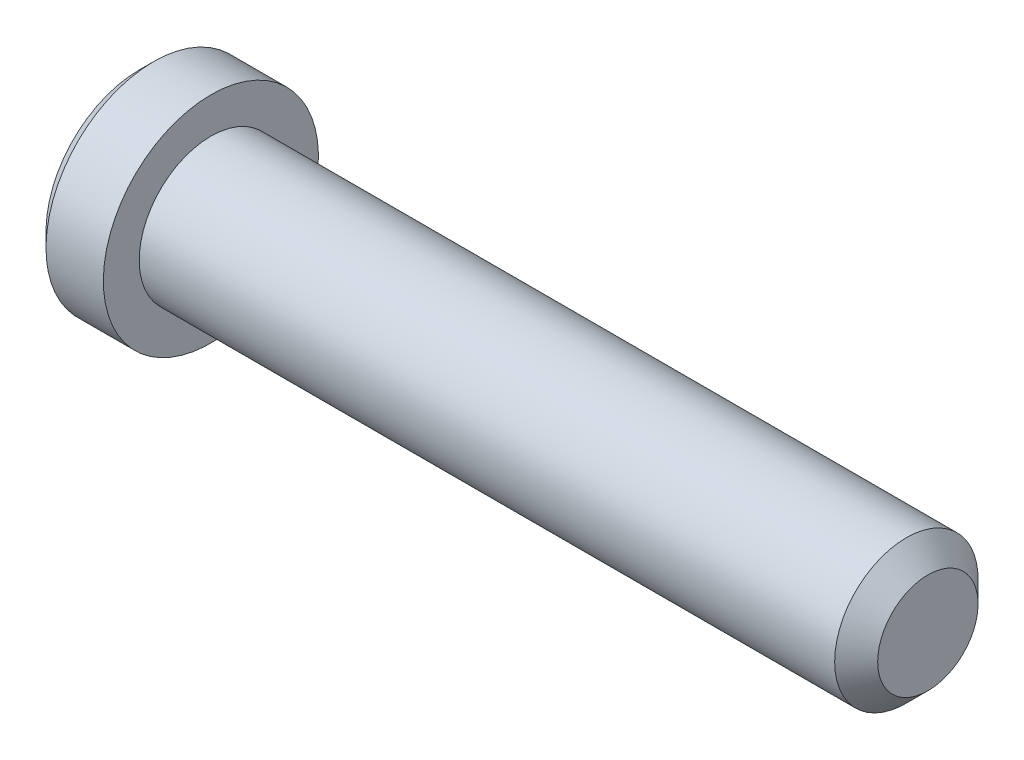
ISO-10303-21;
HEADER;
FILE_DESCRIPTION(('STEP AP214'),'2;1');
FILE_NAME('part.step','',(''),(''),'','','');
FILE_SCHEMA(('AUTOMOTIVE_DESIGN { 1 0 10303 214 1 1 1 1 }'));
ENDSEC;
DATA;
#1=APPLICATION_CONTEXT('core data for automotive mechanical design processes');
#2=APPLICATION_PROTOCOL_DEFINITION('international standard','automotive_design',2000,#1);
#3=PRODUCT_CONTEXT('',#1,'mechanical');
#4=PRODUCT('Part','Part','',(#3));
#5=PRODUCT_RELATED_PRODUCT_CATEGORY('part','',(#4));
#6=PRODUCT_DEFINITION_FORMATION('','',#4);
#7=PRODUCT_DEFINITION_CONTEXT('part definition',#1,'design');
#8=PRODUCT_DEFINITION('design','',#6,#7);
#9=PRODUCT_DEFINITION_SHAPE('','',#8);
#10=(LENGTH_UNIT() NAMED_UNIT(*) SI_UNIT(.MILLI.,.METRE.));
#11=(NAMED_UNIT(*) PLANE_ANGLE_UNIT() SI_UNIT($,.RADIAN.));
#12=(NAMED_UNIT(*) SI_UNIT($,.STERADIAN.) SOLID_ANGLE_UNIT());
#13=UNCERTAINTY_MEASURE_WITH_UNIT(LENGTH_MEASURE(1.E-05),#10,'distance_accuracy_value','');
#14=(GEOMETRIC_REPRESENTATION_CONTEXT(3) GLOBAL_UNCERTAINTY_ASSIGNED_CONTEXT((#13)) GLOBAL_UNIT_ASSIGNED_CONTEXT((#10,
#11,#12)) REPRESENTATION_CONTEXT('',''));
#15=CARTESIAN_POINT('',(0.,0.,0.));
#16=DIRECTION('',(0.,0.,1.));
#17=DIRECTION('',(1.,0.,0.));
#18=AXIS2_PLACEMENT_3D('',#15,#16,#17);
#19=CARTESIAN_POINT('',(-19.05,4.12749999999999,0.));
#20=DIRECTION('',(-1.,0.,0.));
#21=DIRECTION('',(0.,-1.,0.));
#22=AXIS2_PLACEMENT_3D('',#19,#20,#21);
#23=PLANE('',#22);
#24=CARTESIAN_POINT('',(-19.05,0.,0.));
#25=DIRECTION('',(-1.,0.,0.));
#26=DIRECTION('',(0.,-1.,0.));
#27=AXIS2_PLACEMENT_3D('',#24,#25,#26);
#28=CIRCLE('',#27,1.83308710467702);
#29=CARTESIAN_POINT('',(-19.05,-1.83308710467697,-1.64690310000548E-13));
#30=VERTEX_POINT('',#29);
#31=CARTESIAN_POINT('',(-19.05,-0.916543552338599,1.58749999999988));
#32=VERTEX_POINT('',#31);
#33=EDGE_CURVE('E142',#30,#32,#28,.T.);
#34=ORIENTED_EDGE('',*,*,#33,.F.);
#35=CARTESIAN_POINT('',(-19.05,-0.916543552338531,-1.5875));
#36=VERTEX_POINT('',#35);
#37=EDGE_CURVE('E139',#36,#30,#28,.T.);
#38=ORIENTED_EDGE('',*,*,#37,.F.);
#39=CARTESIAN_POINT('',(-19.05,0.916543552338507,-1.5875));
#40=VERTEX_POINT('',#39);
#41=EDGE_CURVE('E107',#40,#36,#28,.T.);
#42=ORIENTED_EDGE('',*,*,#41,.F.);
#43=CARTESIAN_POINT('',(-19.05,1.83308710467708,0.));
#44=VERTEX_POINT('',#43);
#45=EDGE_CURVE('E99',#44,#40,#28,.T.);
#46=ORIENTED_EDGE('',*,*,#45,.F.);
#47=CARTESIAN_POINT('',(-19.05,0.916543552338506,1.5875));
#48=VERTEX_POINT('',#47);
#49=EDGE_CURVE('E60',#48,#44,#28,.T.);
#50=ORIENTED_EDGE('',*,*,#49,.F.);
#51=EDGE_CURVE('E67',#32,#48,#28,.T.);
#52=ORIENTED_EDGE('',*,*,#51,.F.);
#53=EDGE_LOOP('',(#34,#38,#42,#46,#50,#52));
#54=FACE_BOUND('',#53,.T.);
#55=CARTESIAN_POINT('',(-19.05,0.,0.));
#56=DIRECTION('',(1.,0.,0.));
#57=DIRECTION('',(0.,1.,0.));
#58=AXIS2_PLACEMENT_3D('',#55,#56,#57);
#59=CIRCLE('',#58,4.12749999999999);
#60=CARTESIAN_POINT('',(-19.05,4.12749999999999,0.));
#61=VERTEX_POINT('',#60);
#62=EDGE_CURVE('E237',#61,#61,#59,.T.);
#63=ORIENTED_EDGE('',*,*,#62,.F.);
#64=EDGE_LOOP('',(#63));
#65=FACE_BOUND('',#64,.T.);
#66=ADVANCED_FACE('F39',(#54,#65),#23,.T.);
#67=CARTESIAN_POINT('',(-15.875,0.,0.));
#68=DIRECTION('',(1.,0.,0.));
#69=DIRECTION('',(0.,0.,-1.));
#70=AXIS2_PLACEMENT_3D('',#67,#68,#69);
#71=CYLINDRICAL_SURFACE('',#70,3.175);
#72=CARTESIAN_POINT('',(14.9225,0.,0.));
#73=DIRECTION('',(1.,0.,0.));
#74=DIRECTION('',(0.,0.,-1.));
#75=AXIS2_PLACEMENT_3D('',#72,#73,#74);
#76=CIRCLE('',#75,3.175);
#77=CARTESIAN_POINT('',(14.9225,0.,3.175));
#78=VERTEX_POINT('',#77);
#79=EDGE_CURVE('E54',#78,#78,#76,.F.);
#80=ORIENTED_EDGE('',*,*,#79,.T.);
#81=EDGE_LOOP('',(#80));
#82=FACE_BOUND('',#81,.T.);
#83=CARTESIAN_POINT('',(-15.875,0.,0.));
#84=DIRECTION('',(1.,0.,0.));
#85=DIRECTION('',(0.,1.,0.));
#86=AXIS2_PLACEMENT_3D('',#83,#84,#85);
#87=CIRCLE('',#86,3.175);
#88=CARTESIAN_POINT('',(-15.875,3.17499999999999,0.));
#89=VERTEX_POINT('',#88);
#90=EDGE_CURVE('E227',#89,#89,#87,.F.);
#91=ORIENTED_EDGE('',*,*,#90,.F.);
#92=EDGE_LOOP('',(#91));
#93=FACE_BOUND('',#92,.T.);
#94=ADVANCED_FACE('F207',(#82,#93),#71,.T.);
#95=CARTESIAN_POINT('',(15.875,0.,0.));
#96=DIRECTION('',(1.,0.,0.));
#97=DIRECTION('',(0.,0.,-1.));
#98=AXIS2_PLACEMENT_3D('',#95,#96,#97);
#99=PLANE('',#98);
#100=CARTESIAN_POINT('',(15.875,0.,0.));
#101=DIRECTION('',(1.,0.,0.));
#102=DIRECTION('',(0.,0.,-1.));
#103=AXIS2_PLACEMENT_3D('',#100,#101,#102);
#104=CIRCLE('',#103,2.2225);
#105=CARTESIAN_POINT('',(15.875,0.,2.2225));
#106=VERTEX_POINT('',#105);
#107=EDGE_CURVE('E229',#106,#106,#104,.T.);
#108=ORIENTED_EDGE('',*,*,#107,.T.);
#109=EDGE_LOOP('',(#108));
#110=FACE_BOUND('',#109,.T.);
#111=ADVANCED_FACE('F215',(#110),#99,.T.);
#112=CARTESIAN_POINT('',(15.875,0.,0.));
#113=DIRECTION('',(-1.,0.,0.));
#114=DIRECTION('',(0.,0.,1.));
#115=AXIS2_PLACEMENT_3D('',#112,#113,#114);
#116=CONICAL_SURFACE('',#115,2.2225,0.785398163397445);
#117=CARTESIAN_POINT('',(14.9225,0.,3.175));
#118=CARTESIAN_POINT('',(14.932421875,0.,3.165078125));
#119=CARTESIAN_POINT('',(14.94234375,0.,3.15515625));
#120=CARTESIAN_POINT('',(14.9621875,0.,3.1353125));
#121=CARTESIAN_POINT('',(14.972109375,0.,3.125390625));
#122=CARTESIAN_POINT('',(14.991953125,0.,3.105546875));
#123=CARTESIAN_POINT('',(15.001875,0.,3.095625));
#124=CARTESIAN_POINT('',(15.02171875,0.,3.07578125));
#125=CARTESIAN_POINT('',(15.031640625,0.,3.065859375));
#126=CARTESIAN_POINT('',(15.051484375,0.,3.046015625));
#127=CARTESIAN_POINT('',(15.06140625,0.,3.03609375));
#128=CARTESIAN_POINT('',(15.08125,0.,3.01625));
#129=CARTESIAN_POINT('',(15.091171875,0.,3.006328125));
#130=CARTESIAN_POINT('',(15.111015625,0.,2.986484375));
#131=CARTESIAN_POINT('',(15.1209375,0.,2.9765625));
#132=CARTESIAN_POINT('',(15.14078125,0.,2.95671875));
#133=CARTESIAN_POINT('',(15.150703125,0.,2.946796875));
#134=CARTESIAN_POINT('',(15.170546875,0.,2.926953125));
#135=CARTESIAN_POINT('',(15.18046875,0.,2.91703125));
#136=CARTESIAN_POINT('',(15.2003125,0.,2.8971875));
#137=CARTESIAN_POINT('',(15.210234375,0.,2.887265625));
#138=CARTESIAN_POINT('',(15.230078125,0.,2.867421875));
#139=CARTESIAN_POINT('',(15.24,0.,2.8575));
#140=CARTESIAN_POINT('',(15.25984375,0.,2.83765625));
#141=CARTESIAN_POINT('',(15.269765625,0.,2.827734375));
#142=CARTESIAN_POINT('',(15.289609375,0.,2.807890625));
#143=CARTESIAN_POINT('',(15.29953125,0.,2.79796875));
#144=CARTESIAN_POINT('',(15.319375,0.,2.778125));
#145=CARTESIAN_POINT('',(15.329296875,0.,2.768203125));
#146=CARTESIAN_POINT('',(15.349140625,0.,2.748359375));
#147=CARTESIAN_POINT('',(15.3590625,0.,2.7384375));
#148=CARTESIAN_POINT('',(15.37890625,0.,2.71859375));
#149=CARTESIAN_POINT('',(15.388828125,0.,2.708671875));
#150=CARTESIAN_POINT('',(15.408671875,0.,2.688828125));
#151=CARTESIAN_POINT('',(15.41859375,0.,2.67890625));
#152=CARTESIAN_POINT('',(15.4384375,0.,2.6590625));
#153=CARTESIAN_POINT('',(15.448359375,0.,2.649140625));
#154=CARTESIAN_POINT('',(15.468203125,0.,2.629296875));
#155=CARTESIAN_POINT('',(15.478125,0.,2.619375));
#156=CARTESIAN_POINT('',(15.49796875,0.,2.59953125));
#157=CARTESIAN_POINT('',(15.507890625,0.,2.589609375));
#158=CARTESIAN_POINT('',(15.527734375,0.,2.569765625));
#159=CARTESIAN_POINT('',(15.53765625,0.,2.55984375));
#160=CARTESIAN_POINT('',(15.5575,0.,2.54));
#161=CARTESIAN_POINT('',(15.567421875,0.,2.530078125));
#162=CARTESIAN_POINT('',(15.587265625,0.,2.510234375));
#163=CARTESIAN_POINT('',(15.5971875,0.,2.5003125));
#164=CARTESIAN_POINT('',(15.61703125,0.,2.48046875));
#165=CARTESIAN_POINT('',(15.626953125,0.,2.470546875));
#166=CARTESIAN_POINT('',(15.646796875,0.,2.450703125));
#167=CARTESIAN_POINT('',(15.65671875,0.,2.44078125));
#168=CARTESIAN_POINT('',(15.6765625,0.,2.4209375));
#169=CARTESIAN_POINT('',(15.686484375,0.,2.411015625));
#170=CARTESIAN_POINT('',(15.706328125,0.,2.391171875));
#171=CARTESIAN_POINT('',(15.71625,0.,2.38125));
#172=CARTESIAN_POINT('',(15.73609375,0.,2.36140625));
#173=CARTESIAN_POINT('',(15.746015625,0.,2.351484375));
#174=CARTESIAN_POINT('',(15.765859375,0.,2.331640625));
#175=CARTESIAN_POINT('',(15.77578125,0.,2.32171875));
#176=CARTESIAN_POINT('',(15.795625,0.,2.301875));
#177=CARTESIAN_POINT('',(15.805546875,0.,2.291953125));
#178=CARTESIAN_POINT('',(15.825390625,0.,2.272109375));
#179=CARTESIAN_POINT('',(15.8353125,0.,2.2621875));
#180=CARTESIAN_POINT('',(15.85515625,0.,2.24234375));
#181=CARTESIAN_POINT('',(15.865078125,0.,2.232421875));
#182=CARTESIAN_POINT('',(15.875,0.,2.2225));
#183=B_SPLINE_CURVE_WITH_KNOTS('',3,(#117,#118,#119,#120,#121,#122,#123,#124,#125,#126,#127,
#128,#129,#130,#131,#132,#133,#134,#135,#136,#137,#138,#139,#140,#141,#142,#143,#144,#145,#146,
#147,#148,#149,#150,#151,#152,#153,#154,#155,#156,#157,#158,#159,#160,#161,#162,#163,#164,#165,
#166,#167,#168,#169,#170,#171,#172,#173,#174,#175,#176,#177,#178,#179,#180,#181,#182),
.UNSPECIFIED.,.F.,.F.,(4,2,2,2,2,2,2,2,2,2,2,2,2,2,2,2,2,2,2,2,2,2,2,2,2,2,2,2,2,2,2,2,4),(0.,
0.042094950567512,0.0841899011350241,0.126284851702535,0.168379802270047,0.210474752837559,
0.25256970340507,0.294664653972582,0.336759604540093,0.378854555107605,0.420949505675117,
0.463044456242628,0.50513940681014,0.547234357377651,0.589329307945163,0.631424258512675,
0.673519209080186,0.715614159647698,0.757709110215209,0.799804060782721,0.841899011350233,
0.883993961917743,0.926088912485256,0.968183863052768,1.01027881362028,1.05237376418779,
1.0944687147553,1.13656366532281,1.17865861589032,1.22075356645784,1.26284851702535,
1.30494346759286,1.34703841816037),.UNSPECIFIED.);
#184=EDGE_CURVE('BSEAM41',#78,#106,#183,.T.);
#185=ORIENTED_EDGE('',*,*,#79,.F.);
#186=ORIENTED_EDGE('',*,*,#107,.F.);
#187=ORIENTED_EDGE('',*,*,#184,.T.);
#188=ORIENTED_EDGE('',*,*,#184,.F.);
#189=EDGE_LOOP('',(#185,#187,#186,#188));
#190=FACE_BOUND('',#189,.T.);
#191=ADVANCED_FACE('F41',(#190),#116,.T.);
#192=CARTESIAN_POINT('',(-15.875,0.,0.));
#193=DIRECTION('',(1.,0.,0.));
#194=DIRECTION('',(0.,1.,0.));
#195=AXIS2_PLACEMENT_3D('',#192,#193,#194);
#196=CYLINDRICAL_SURFACE('',#195,4.7625);
#197=CARTESIAN_POINT('',(-18.415,0.,0.));
#198=DIRECTION('',(1.,0.,0.));
#199=DIRECTION('',(0.,1.,0.));
#200=AXIS2_PLACEMENT_3D('',#197,#198,#199);
#201=CIRCLE('',#200,4.7625);
#202=CARTESIAN_POINT('',(-18.415,4.76249999999999,0.));
#203=VERTEX_POINT('',#202);
#204=EDGE_CURVE('E230',#203,#203,#201,.T.);
#205=ORIENTED_EDGE('',*,*,#204,.T.);
#206=EDGE_LOOP('',(#205));
#207=FACE_BOUND('',#206,.T.);
#208=CARTESIAN_POINT('',(-15.875,0.,0.));
#209=DIRECTION('',(1.,0.,0.));
#210=DIRECTION('',(0.,1.,0.));
#211=AXIS2_PLACEMENT_3D('',#208,#209,#210);
#212=CIRCLE('',#211,4.7625);
#213=CARTESIAN_POINT('',(-15.875,4.7625,0.));
#214=VERTEX_POINT('',#213);
#215=EDGE_CURVE('E244',#214,#214,#212,.T.);
#216=ORIENTED_EDGE('',*,*,#215,.F.);
#217=EDGE_LOOP('',(#216));
#218=FACE_BOUND('',#217,.T.);
#219=ADVANCED_FACE('F210',(#207,#218),#196,.T.);
#220=CARTESIAN_POINT('',(-18.415,0.,0.));
#221=DIRECTION('',(1.,0.,0.));
#222=DIRECTION('',(0.,1.,0.));
#223=AXIS2_PLACEMENT_3D('',#220,#221,#222);
#224=CONICAL_SURFACE('',#223,4.7625,0.785398163397451);
#225=ORIENTED_EDGE('',*,*,#62,.T.);
#226=EDGE_LOOP('',(#225));
#227=FACE_BOUND('',#226,.T.);
#228=ORIENTED_EDGE('',*,*,#204,.F.);
#229=EDGE_LOOP('',(#228));
#230=FACE_BOUND('',#229,.T.);
#231=ADVANCED_FACE('F203',(#227,#230),#224,.T.);
#232=CARTESIAN_POINT('',(-15.875,4.7625,0.));
#233=DIRECTION('',(1.,0.,0.));
#234=DIRECTION('',(0.,1.,0.));
#235=AXIS2_PLACEMENT_3D('',#232,#233,#234);
#236=PLANE('',#235);
#237=ORIENTED_EDGE('',*,*,#90,.T.);
#238=EDGE_LOOP('',(#237));
#239=FACE_BOUND('',#238,.T.);
#240=ORIENTED_EDGE('',*,*,#215,.T.);
#241=EDGE_LOOP('',(#240));
#242=FACE_BOUND('',#241,.T.);
#243=ADVANCED_FACE('F166',(#239,#242),#236,.T.);
#244=CARTESIAN_POINT('',(-19.05,0.,0.));
#245=DIRECTION('',(-1.,0.,0.));
#246=DIRECTION('',(0.,-1.,0.));
#247=AXIS2_PLACEMENT_3D('',#244,#245,#246);
#248=CONICAL_SURFACE('',#247,1.83308710467702,0.78539816339745);
#249=CARTESIAN_POINT('',(-19.6379872632542,-1.82796193752855,-1.5875));
#250=CARTESIAN_POINT('',(-19.6043866526756,-1.78345227640909,-1.5875));
#251=CARTESIAN_POINT('',(-19.5711154952983,-1.73869460884115,-1.5875));
#252=CARTESIAN_POINT('',(-19.5053681178339,-1.64858256619969,-1.5875));
#253=CARTESIAN_POINT('',(-19.4728920993983,-1.60322804415398,-1.5875));
#254=CARTESIAN_POINT('',(-19.3763976121246,-1.46545441997288,-1.5875));
#255=CARTESIAN_POINT('',(-19.3138301635838,-1.37200191361453,-1.5875));
#256=CARTESIAN_POINT('',(-19.1910028045271,-1.17603565005264,-1.5875));
#257=CARTESIAN_POINT('',(-19.1310784497351,-1.07330915482379,-1.5875));
#258=CARTESIAN_POINT('',(-19.0214640327189,-0.86272519118087,-1.5875));
#259=CARTESIAN_POINT('',(-18.9717394689972,-0.75488659170371,-1.5875));
#260=CARTESIAN_POINT('',(-18.9109060741113,-0.593019911876868,-1.5875));
#261=CARTESIAN_POINT('',(-18.8934464520655,-0.541388282021799,-1.5875));
#262=CARTESIAN_POINT('',(-18.8626723678696,-0.436878539726272,-1.5875));
#263=CARTESIAN_POINT('',(-18.849358191283,-0.384000341684431,-1.5875));
#264=CARTESIAN_POINT('',(-18.8277883054897,-0.278196924280243,-1.5875));
#265=CARTESIAN_POINT('',(-18.8194459280049,-0.225289653887496,-1.5875));
#266=CARTESIAN_POINT('',(-18.8079825177098,-0.118909299564297,-1.5875));
#267=CARTESIAN_POINT('',(-18.8048605873604,-0.0654363144870471,-1.5875));
#268=CARTESIAN_POINT('',(-18.8040696410889,0.0396125416394014,-1.5875));
#269=CARTESIAN_POINT('',(-18.8062073430076,0.0911870234777274,-1.5875));
#270=CARTESIAN_POINT('',(-18.8153913684641,0.193894008986174,-1.5875));
#271=CARTESIAN_POINT('',(-18.8224381688511,0.245026469231639,-1.5875));
#272=CARTESIAN_POINT('',(-18.8411752166609,0.347344844708789,-1.5875));
#273=CARTESIAN_POINT('',(-18.8529444835388,0.398516068757408,-1.5875));
#274=CARTESIAN_POINT('',(-18.880500946481,0.499740445944891,-1.5875));
#275=CARTESIAN_POINT('',(-18.8962878063499,0.549793692255998,-1.5875));
#276=CARTESIAN_POINT('',(-18.9519297782164,0.707380773963404,-1.5875));
#277=CARTESIAN_POINT('',(-18.998121862458,0.812671633972117,-1.5875));
#278=CARTESIAN_POINT('',(-19.1008243357708,1.01830702525803,-1.5875));
#279=CARTESIAN_POINT('',(-19.1573717953495,1.11863208590434,-1.5875));
#280=CARTESIAN_POINT('',(-19.2740341931104,1.31036772781776,-1.5875));
#281=CARTESIAN_POINT('',(-19.3338322157844,1.40197355431628,-1.5875));
#282=CARTESIAN_POINT('',(-19.4262738021752,1.53693633902004,-1.5875));
#283=CARTESIAN_POINT('',(-19.457413627594,1.58134147295669,-1.5875));
#284=CARTESIAN_POINT('',(-19.5205168194014,1.66954488801528,-1.5875));
#285=CARTESIAN_POINT('',(-19.5524799569622,1.71334333266284,-1.5875));
#286=CARTESIAN_POINT('',(-19.5847844886323,1.75688919183919,-1.5875));
#287=B_SPLINE_CURVE_WITH_KNOTS('',3,(#249,#250,#251,#252,#253,#254,#255,#256,#257,#258,#259,
#260,#261,#262,#263,#264,#265,#266,#267,#268,#269,#270,#271,#272,#273,#274,#275,#276,#277,#278,
#279,#280,#281,#282,#283,#284,#285,#286),.UNSPECIFIED.,.F.,.F.,(4,2,2,2,2,2,2,2,2,2,2,2,2,2,2,2,
2,2,4),(0.,0.167300856038505,0.334643709948965,0.671883358487479,1.02837224639234,
1.38363464368224,1.54700775551675,1.71039211899215,1.87083807359557,2.03125644026835,
2.18586834465342,2.34049526948598,2.49782525419336,2.65514207772681,2.99906299923223,
3.34424006214773,3.67226428551501,3.83496498281163,3.99762093763065),.UNSPECIFIED.);
#288=EDGE_CURVE('E11',#36,#40,#287,.T.);
#289=ORIENTED_EDGE('',*,*,#288,.T.);
#290=ORIENTED_EDGE('',*,*,#41,.T.);
#291=EDGE_LOOP('',(#289,#290));
#292=FACE_BOUND('',#291,.T.);
#293=ADVANCED_FACE('F112',(#292),#248,.F.);
#294=CARTESIAN_POINT('',(-19.0501154809638,-1.8332025747309,0.000200000000000733));
#295=CARTESIAN_POINT('',(-19.0186308083707,-1.80169356364378,-0.0543752080991366));
#296=CARTESIAN_POINT('',(-18.9889950460136,-1.7696576508122,-0.109863036790291));
#297=CARTESIAN_POINT('',(-18.9347322600209,-1.70433272872467,-0.223009120846364));
#298=CARTESIAN_POINT('',(-18.9101354351333,-1.67103750434037,-0.280678141129388));
#299=CARTESIAN_POINT('',(-18.8680003642727,-1.60389924243975,-0.396965021873115));
#300=CARTESIAN_POINT('',(-18.8503561927299,-1.57007331012483,-0.455553255255945));
#301=CARTESIAN_POINT('',(-18.8231714700851,-1.50167663406844,-0.574019773254449));
#302=CARTESIAN_POINT('',(-18.8136106206952,-1.467107980828,-0.633894437016124));
#303=CARTESIAN_POINT('',(-18.8049844131041,-1.40753305920536,-0.737081228123465));
#304=CARTESIAN_POINT('',(-18.8037071928097,-1.38260379284921,-0.780259984047736));
#305=CARTESIAN_POINT('',(-18.8058570558148,-1.33278598321001,-0.866546961464628));
#306=CARTESIAN_POINT('',(-18.8092857885494,-1.30789745726815,-0.909655152921416));
#307=CARTESIAN_POINT('',(-18.8206509944334,-1.25836166322467,-0.995453664997999));
#308=CARTESIAN_POINT('',(-18.8285913718017,-1.23371462291264,-1.03814359107463));
#309=CARTESIAN_POINT('',(-18.8485484144512,-1.18483421762829,-1.12280693652168));
#310=CARTESIAN_POINT('',(-18.8605668292088,-1.16060103489493,-1.16478004024496));
#311=CARTESIAN_POINT('',(-18.8962468972473,-1.09853097253204,-1.27228854188646));
#312=CARTESIAN_POINT('',(-18.9225985723032,-1.06107901897433,-1.33715722829112));
#313=CARTESIAN_POINT('',(-18.9670835368518,-1.00601067345515,-1.43253840061909));
#314=CARTESIAN_POINT('',(-18.9827128578012,-0.987864034968908,-1.46396930046385));
#315=CARTESIAN_POINT('',(-19.0153984878612,-0.951904515944211,-1.52625301443037));
#316=CARTESIAN_POINT('',(-19.032454115657,-0.934091480971892,-1.55710609603943));
#317=CARTESIAN_POINT('',(-19.0501154809638,-0.916428082284693,-1.5877));
#318=B_SPLINE_CURVE_WITH_KNOTS('',3,(#294,#295,#296,#297,#298,#299,#300,#301,#302,#303,#304,
#305,#306,#307,#308,#309,#310,#311,#312,#313,#314,#315,#316,#317),.UNSPECIFIED.,.F.,.F.,(4,2,2,
2,2,2,2,2,2,2,2,4),(0.,0.211482650810822,0.424197870807289,0.633533884524837,0.842342653263376,
0.991755553727173,1.14122083674208,1.29081565918881,1.44047473906442,1.67818780869722,
1.79671410024895,1.91518409436631),.UNSPECIFIED.);
#319=EDGE_CURVE('E145',#30,#36,#318,.T.);
#320=ORIENTED_EDGE('',*,*,#319,.T.);
#321=ORIENTED_EDGE('',*,*,#37,.T.);
#322=EDGE_LOOP('',(#320,#321));
#323=FACE_BOUND('',#322,.T.);
#324=ADVANCED_FACE('F165',(#323),#248,.F.);
#325=CARTESIAN_POINT('',(-19.0501154809638,-0.916428082284693,1.5877));
#326=CARTESIAN_POINT('',(-19.0186308083707,-0.947937093371808,1.53312479190087));
#327=CARTESIAN_POINT('',(-18.9889950460136,-0.979973006203392,1.47763696320971));
#328=CARTESIAN_POINT('',(-18.9347322600209,-1.04529792829091,1.36449087915365));
#329=CARTESIAN_POINT('',(-18.9101354351333,-1.07859315267522,1.30682185887063));
#330=CARTESIAN_POINT('',(-18.8680003642727,-1.14573141457583,1.19053497812691));
#331=CARTESIAN_POINT('',(-18.8503561927299,-1.17955734689075,1.13194674474408));
#332=CARTESIAN_POINT('',(-18.8231714700851,-1.24795402294713,1.01348022674559));
#333=CARTESIAN_POINT('',(-18.8136106206952,-1.28252267618757,0.953605562983914));
#334=CARTESIAN_POINT('',(-18.8049844131041,-1.34209759781021,0.850418771876577));
#335=CARTESIAN_POINT('',(-18.8037071928097,-1.36702686416636,0.807240015952307));
#336=CARTESIAN_POINT('',(-18.8058570558148,-1.41684467380556,0.720953038535416));
#337=CARTESIAN_POINT('',(-18.8092857885494,-1.44173319974742,0.677844847078628));
#338=CARTESIAN_POINT('',(-18.8206509944334,-1.4912689937909,0.592046335002045));
#339=CARTESIAN_POINT('',(-18.8285913718017,-1.51591603410292,0.549356408925419));
#340=CARTESIAN_POINT('',(-18.8485484144512,-1.56479643938727,0.46469306347837));
#341=CARTESIAN_POINT('',(-18.8605668292088,-1.58902962212064,0.422719959755085));
#342=CARTESIAN_POINT('',(-18.8962468972473,-1.65109968448354,0.315211458113574));
#343=CARTESIAN_POINT('',(-18.9225985723032,-1.68855163804125,0.250342771708907));
#344=CARTESIAN_POINT('',(-18.9670835368518,-1.74361998356043,0.154961599380927));
#345=CARTESIAN_POINT('',(-18.9827128578012,-1.76176662204668,0.123530699536159));
#346=CARTESIAN_POINT('',(-19.0153984878612,-1.79772614107138,0.0612469855696373));
#347=CARTESIAN_POINT('',(-19.0324541156571,-1.8155391760437,0.0303939039605762));
#348=CARTESIAN_POINT('',(-19.0501154809638,-1.8332025747309,-0.000200000000000233));
#349=B_SPLINE_CURVE_WITH_KNOTS('',3,(#325,#326,#327,#328,#329,#330,#331,#332,#333,#334,#335,
#336,#337,#338,#339,#340,#341,#342,#343,#344,#345,#346,#347,#348),.UNSPECIFIED.,.F.,.F.,(4,2,2,
2,2,2,2,2,2,2,2,4),(0.,0.211482650810809,0.424197870807261,0.633533884524793,0.842342653263319,
0.991755553727115,1.14122083674202,1.29081565918875,1.44047473906436,1.67818780869719,
1.79671410024894,1.91518409436631),.UNSPECIFIED.);
#350=EDGE_CURVE('E153',#32,#30,#349,.T.);
#351=ORIENTED_EDGE('',*,*,#350,.T.);
#352=ORIENTED_EDGE('',*,*,#33,.T.);
#353=EDGE_LOOP('',(#351,#352));
#354=FACE_BOUND('',#353,.T.);
#355=ADVANCED_FACE('F291',(#354),#248,.F.);
#356=CARTESIAN_POINT('',(-19.6379872630534,-1.82796193726259,1.5875));
#357=CARTESIAN_POINT('',(-19.6043866524825,-1.78345227615059,1.5875));
#358=CARTESIAN_POINT('',(-19.5711154951129,-1.73869460859014,1.5875));
#359=CARTESIAN_POINT('',(-19.505368117664,-1.64858256596372,1.5875));
#360=CARTESIAN_POINT('',(-19.472892099236,-1.60322804392558,1.5875));
#361=CARTESIAN_POINT('',(-19.3763976119855,-1.46545441976761,1.5875));
#362=CARTESIAN_POINT('',(-19.3138301634601,-1.372001913425,1.5875));
#363=CARTESIAN_POINT('',(-19.191002804435,-1.17603564989744,1.5875));
#364=CARTESIAN_POINT('',(-19.1310784496592,-1.07330915468726,1.5875));
#365=CARTESIAN_POINT('',(-19.0214640326729,-0.86272519108328,1.5875));
#366=CARTESIAN_POINT('',(-18.971739468965,-0.75488659162637,1.5875));
#367=CARTESIAN_POINT('',(-18.9109060740894,-0.593019911814766,1.5875));
#368=CARTESIAN_POINT('',(-18.8934464520431,-0.541388281953317,1.5875));
#369=CARTESIAN_POINT('',(-18.8626723678478,-0.436878539644821,1.5875));
#370=CARTESIAN_POINT('',(-18.8493581912621,-0.384000341596389,1.5875));
#371=CARTESIAN_POINT('',(-18.827788305472,-0.278196924179239,1.5875));
#372=CARTESIAN_POINT('',(-18.8194459279895,-0.225289653780123,1.5875));
#373=CARTESIAN_POINT('',(-18.8079825177006,-0.118909299444399,1.5875));
#374=CARTESIAN_POINT('',(-18.804860587355,-0.0654363143609937,1.5875));
#375=CARTESIAN_POINT('',(-18.8040696410922,0.0396125417768126,1.5875));
#376=CARTESIAN_POINT('',(-18.8062073430157,0.0911870236203568,1.5875));
#377=CARTESIAN_POINT('',(-18.8153913684824,0.193894009138717,1.5875));
#378=CARTESIAN_POINT('',(-18.822438168875,0.245026469388878,1.5875));
#379=CARTESIAN_POINT('',(-18.8411752166964,0.347344844875298,1.5875));
#380=CARTESIAN_POINT('',(-18.8529444835804,0.398516068928477,1.5875));
#381=CARTESIAN_POINT('',(-18.8805009465349,0.49974044612464,1.5875));
#382=CARTESIAN_POINT('',(-18.89628780641,0.549793692439866,1.5875));
#383=CARTESIAN_POINT('',(-18.9519297783059,0.70738077418731,1.5875));
#384=CARTESIAN_POINT('',(-18.9981218625745,0.812671634229933,1.5875));
#385=CARTESIAN_POINT('',(-19.1008243359444,1.01830702558106,1.5875));
#386=CARTESIAN_POINT('',(-19.1573717955531,1.11863208625866,1.5875));
#387=CARTESIAN_POINT('',(-19.2740341933715,1.31036772822834,1.5875));
#388=CARTESIAN_POINT('',(-19.3338322160727,1.40197355475203,1.5875));
#389=CARTESIAN_POINT('',(-19.4262738025041,1.536936339493,1.5875));
#390=CARTESIAN_POINT('',(-19.4574136279364,1.58134147344187,1.5875));
#391=CARTESIAN_POINT('',(-19.5205168197706,1.66954488852483,1.5875));
#392=CARTESIAN_POINT('',(-19.5524799573449,1.71334333318454,1.5875));
#393=CARTESIAN_POINT('',(-19.5847844890284,1.75688919237302,1.5875));
#394=B_SPLINE_CURVE_WITH_KNOTS('',3,(#356,#357,#358,#359,#360,#361,#362,#363,#364,#365,#366,
#367,#368,#369,#370,#371,#372,#373,#374,#375,#376,#377,#378,#379,#380,#381,#382,#383,#384,#385,
#386,#387,#388,#389,#390,#391,#392,#393),.UNSPECIFIED.,.F.,.F.,(4,2,2,2,2,2,2,2,2,2,2,2,2,2,2,2,
2,2,4),(0.,0.167300856006663,0.334643709885268,0.671883358358889,1.02837224619097,
1.38363464340878,1.54700775526175,1.71039211875556,1.87083807337665,2.0312564400671,
2.18586834446834,2.34049526931708,2.49782525404189,2.65514207759276,2.99906299922337,
3.34424006226489,3.67226428573999,3.83496498308979,3.99762093796198),.UNSPECIFIED.);
#395=EDGE_CURVE('E173',#48,#32,#394,.F.);
#396=ORIENTED_EDGE('',*,*,#395,.T.);
#397=ORIENTED_EDGE('',*,*,#51,.T.);
#398=EDGE_LOOP('',(#396,#397));
#399=FACE_BOUND('',#398,.T.);
#400=ADVANCED_FACE('F309',(#399),#248,.F.);
#401=CARTESIAN_POINT('',(-19.0501154809637,1.8332025747309,-0.000200000000000271));
#402=CARTESIAN_POINT('',(-19.0186308083706,1.80169356364378,0.0543752080991352));
#403=CARTESIAN_POINT('',(-18.9889950460135,1.7696576508122,0.109863036790287));
#404=CARTESIAN_POINT('',(-18.9347322600208,1.70433272872468,0.223009120846353));
#405=CARTESIAN_POINT('',(-18.9101354351332,1.67103750434037,0.280678141129374));
#406=CARTESIAN_POINT('',(-18.8680003642726,1.60389924243977,0.396965021873093));
#407=CARTESIAN_POINT('',(-18.8503561927298,1.57007331012485,0.455553255255919));
#408=CARTESIAN_POINT('',(-18.823171470085,1.50167663406846,0.574019773254416));
#409=CARTESIAN_POINT('',(-18.8136106206951,1.46710798082802,0.633894437016088));
#410=CARTESIAN_POINT('',(-18.804984413104,1.40753305920538,0.737081228123422));
#411=CARTESIAN_POINT('',(-18.8037071928096,1.38260379284923,0.780259984047691));
#412=CARTESIAN_POINT('',(-18.8058570558147,1.33278598321004,0.866546961464578));
#413=CARTESIAN_POINT('',(-18.8092857885493,1.30789745726818,0.909655152921363));
#414=CARTESIAN_POINT('',(-18.8206509944333,1.2583616632247,0.995453664997943));
#415=CARTESIAN_POINT('',(-18.8285913718016,1.23371462291268,1.03814359107457));
#416=CARTESIAN_POINT('',(-18.8485484144511,1.18483421762833,1.12280693652161));
#417=CARTESIAN_POINT('',(-18.8605668292087,1.16060103489497,1.16478004024489));
#418=CARTESIAN_POINT('',(-18.8962468972472,1.09853097253207,1.27228854188641));
#419=CARTESIAN_POINT('',(-18.9225985723031,1.06107901897435,1.33715722829108));
#420=CARTESIAN_POINT('',(-18.9670835368517,1.00601067345517,1.43253840061906));
#421=CARTESIAN_POINT('',(-18.9827128578011,0.98786403496892,1.46396930046383));
#422=CARTESIAN_POINT('',(-19.0153984878611,0.951904515944218,1.52625301443036));
#423=CARTESIAN_POINT('',(-19.032454115657,0.934091480971896,1.55710609603942));
#424=CARTESIAN_POINT('',(-19.0501154809637,0.916428082284694,1.5877));
#425=B_SPLINE_CURVE_WITH_KNOTS('',3,(#401,#402,#403,#404,#405,#406,#407,#408,#409,#410,#411,
#412,#413,#414,#415,#416,#417,#418,#419,#420,#421,#422,#423,#424),.UNSPECIFIED.,.F.,.F.,(4,2,2,
2,2,2,2,2,2,2,2,4),(0.,0.211482650810812,0.424197870807266,0.633533884524799,0.842342653263325,
0.991755553727114,1.14122083674201,1.29081565918874,1.44047473906434,1.67818780869718,
1.79671410024893,1.91518409436631),.UNSPECIFIED.);
#426=EDGE_CURVE('E128',#44,#48,#425,.T.);
#427=ORIENTED_EDGE('',*,*,#426,.T.);
#428=ORIENTED_EDGE('',*,*,#49,.T.);
#429=EDGE_LOOP('',(#427,#428));
#430=FACE_BOUND('',#429,.T.);
#431=ADVANCED_FACE('F281',(#430),#248,.F.);
#432=CARTESIAN_POINT('',(-19.0501154809637,0.916428082284694,-1.5877));
#433=CARTESIAN_POINT('',(-19.0186308083706,0.947937093371811,-1.53312479190086));
#434=CARTESIAN_POINT('',(-18.9889950460135,0.979973006203397,-1.47763696320971));
#435=CARTESIAN_POINT('',(-18.9347322600208,1.04529792829092,-1.36449087915364));
#436=CARTESIAN_POINT('',(-18.9101354351332,1.07859315267523,-1.30682185887061));
#437=CARTESIAN_POINT('',(-18.8680003642726,1.14573141457584,-1.19053497812689));
#438=CARTESIAN_POINT('',(-18.8503561927298,1.17955734689076,-1.13194674474406));
#439=CARTESIAN_POINT('',(-18.823171470085,1.24795402294715,-1.01348022674555));
#440=CARTESIAN_POINT('',(-18.8136106206951,1.28252267618759,-0.953605562983879));
#441=CARTESIAN_POINT('',(-18.804984413104,1.34209759781023,-0.850418771876541));
#442=CARTESIAN_POINT('',(-18.8037071928096,1.36702686416638,-0.807240015952272));
#443=CARTESIAN_POINT('',(-18.8058570558147,1.41684467380558,-0.720953038535386));
#444=CARTESIAN_POINT('',(-18.8092857885493,1.44173319974743,-0.6778448470786));
#445=CARTESIAN_POINT('',(-18.8206509944333,1.49126899379091,-0.592046335002021));
#446=CARTESIAN_POINT('',(-18.8285913718016,1.51591603410294,-0.549356408925398));
#447=CARTESIAN_POINT('',(-18.8485484144511,1.56479643938728,-0.464693063478352));
#448=CARTESIAN_POINT('',(-18.8605668292087,1.58902962212065,-0.422719959755068));
#449=CARTESIAN_POINT('',(-18.8962468972472,1.65109968448354,-0.315211458113562));
#450=CARTESIAN_POINT('',(-18.9225985723031,1.68855163804125,-0.250342771708897));
#451=CARTESIAN_POINT('',(-18.9670835368517,1.74361998356043,-0.154961599380922));
#452=CARTESIAN_POINT('',(-18.9827128578011,1.76176662204668,-0.123530699536154));
#453=CARTESIAN_POINT('',(-19.0153984878611,1.79772614107138,-0.0612469855696352));
#454=CARTESIAN_POINT('',(-19.032454115657,1.8155391760437,-0.0303939039605755));
#455=CARTESIAN_POINT('',(-19.0501154809637,1.8332025747309,0.000200000000000133));
#456=B_SPLINE_CURVE_WITH_KNOTS('',3,(#432,#433,#434,#435,#436,#437,#438,#439,#440,#441,#442,
#443,#444,#445,#446,#447,#448,#449,#450,#451,#452,#453,#454,#455),.UNSPECIFIED.,.F.,.F.,(4,2,2,
2,2,2,2,2,2,2,2,4),(0.,0.211482650810823,0.424197870807288,0.633533884524834,0.842342653263372,
0.991755553727162,1.14122083674206,1.29081565918879,1.44047473906438,1.67818780869721,
1.79671410024895,1.91518409436631),.UNSPECIFIED.);
#457=EDGE_CURVE('E102',#40,#44,#456,.T.);
#458=ORIENTED_EDGE('',*,*,#457,.T.);
#459=ORIENTED_EDGE('',*,*,#45,.T.);
#460=EDGE_LOOP('',(#458,#459));
#461=FACE_BOUND('',#460,.T.);
#462=ADVANCED_FACE('F100',(#461),#248,.F.);
#463=CARTESIAN_POINT('',(-16.6624,1.83308710467706,0.));
#464=DIRECTION('',(1.,0.,0.));
#465=DIRECTION('',(0.,0.,-1.));
#466=AXIS2_PLACEMENT_3D('',#463,#464,#465);
#467=PLANE('',#466);
#468=DIRECTION('',(0.,0.5,0.866025403784439));
#469=VECTOR('',#468,1.);
#470=CARTESIAN_POINT('',(-16.6624,0.916543552338531,-1.5875));
#471=LINE('',#470,#469);
#472=CARTESIAN_POINT('',(-16.6624,0.916543552338531,-1.5875));
#473=VERTEX_POINT('',#472);
#474=CARTESIAN_POINT('',(-16.6624,1.83308710467706,0.));
#475=VERTEX_POINT('',#474);
#476=EDGE_CURVE('E127',#473,#475,#471,.T.);
#477=ORIENTED_EDGE('',*,*,#476,.F.);
#478=DIRECTION('',(0.,1.,0.));
#479=VECTOR('',#478,1.);
#480=CARTESIAN_POINT('',(-16.6624,-0.916543552338531,-1.5875));
#481=LINE('',#480,#479);
#482=CARTESIAN_POINT('',(-16.6624,-0.916543552338531,-1.5875));
#483=VERTEX_POINT('',#482);
#484=EDGE_CURVE('E132',#483,#473,#481,.T.);
#485=ORIENTED_EDGE('',*,*,#484,.F.);
#486=DIRECTION('',(0.,0.5,-0.866025403784439));
#487=VECTOR('',#486,1.);
#488=CARTESIAN_POINT('',(-16.6624,-1.83308710467706,0.));
#489=LINE('',#488,#487);
#490=CARTESIAN_POINT('',(-16.6624,-1.83308710467706,0.));
#491=VERTEX_POINT('',#490);
#492=EDGE_CURVE('E266',#491,#483,#489,.T.);
#493=ORIENTED_EDGE('',*,*,#492,.F.);
#494=DIRECTION('',(0.,-0.5,-0.866025403784439));
#495=VECTOR('',#494,1.);
#496=CARTESIAN_POINT('',(-16.6624,-0.916543552338531,1.5875));
#497=LINE('',#496,#495);
#498=CARTESIAN_POINT('',(-16.6624,-0.916543552338531,1.5875));
#499=VERTEX_POINT('',#498);
#500=EDGE_CURVE('E269',#499,#491,#497,.T.);
#501=ORIENTED_EDGE('',*,*,#500,.F.);
#502=DIRECTION('',(0.,-1.,0.));
#503=VECTOR('',#502,1.);
#504=CARTESIAN_POINT('',(-16.6624,0.916543552338531,1.5875));
#505=LINE('',#504,#503);
#506=CARTESIAN_POINT('',(-16.6624,0.916543552338531,1.5875));
#507=VERTEX_POINT('',#506);
#508=EDGE_CURVE('E272',#507,#499,#505,.T.);
#509=ORIENTED_EDGE('',*,*,#508,.F.);
#510=DIRECTION('',(0.,-0.5,0.866025403784439));
#511=VECTOR('',#510,1.);
#512=CARTESIAN_POINT('',(-16.6624,1.83308710467706,0.));
#513=LINE('',#512,#511);
#514=EDGE_CURVE('E275',#475,#507,#513,.T.);
#515=ORIENTED_EDGE('',*,*,#514,.F.);
#516=EDGE_LOOP('',(#477,#485,#493,#501,#509,#515));
#517=FACE_BOUND('',#516,.T.);
#518=ADVANCED_FACE('F167',(#517),#467,.F.);
#519=CARTESIAN_POINT('',(-16.6624,-0.916543552338531,-1.5875));
#520=DIRECTION('',(0.,0.,1.));
#521=DIRECTION('',(0.,-1.,0.));
#522=AXIS2_PLACEMENT_3D('',#519,#520,#521);
#523=PLANE('',#522);
#524=ORIENTED_EDGE('',*,*,#288,.F.);
#525=DIRECTION('',(-1.,0.,0.));
#526=VECTOR('',#525,1.);
#527=CARTESIAN_POINT('',(-16.6624,-0.916543552338531,-1.5875));
#528=LINE('',#527,#526);
#529=EDGE_CURVE('E134',#483,#36,#528,.T.);
#530=ORIENTED_EDGE('',*,*,#529,.F.);
#531=ORIENTED_EDGE('',*,*,#484,.T.);
#532=DIRECTION('',(-1.,0.,0.));
#533=VECTOR('',#532,1.);
#534=CARTESIAN_POINT('',(-16.6624,0.916543552338531,-1.5875));
#535=LINE('',#534,#533);
#536=EDGE_CURVE('E122',#473,#40,#535,.T.);
#537=ORIENTED_EDGE('',*,*,#536,.T.);
#538=EDGE_LOOP('',(#524,#530,#531,#537));
#539=FACE_BOUND('',#538,.T.);
#540=ADVANCED_FACE('F130',(#539),#523,.T.);
#541=CARTESIAN_POINT('',(-16.6624,-1.83308710467706,0.));
#542=DIRECTION('',(0.,0.866025403784439,0.5));
#543=DIRECTION('',(0.,-0.5,0.866025403784439));
#544=AXIS2_PLACEMENT_3D('',#541,#542,#543);
#545=PLANE('',#544);
#546=ORIENTED_EDGE('',*,*,#319,.F.);
#547=DIRECTION('',(-1.,0.,0.));
#548=VECTOR('',#547,1.);
#549=CARTESIAN_POINT('',(-16.6624,-1.83308710467706,0.));
#550=LINE('',#549,#548);
#551=EDGE_CURVE('E258',#491,#30,#550,.T.);
#552=ORIENTED_EDGE('',*,*,#551,.F.);
#553=ORIENTED_EDGE('',*,*,#492,.T.);
#554=ORIENTED_EDGE('',*,*,#529,.T.);
#555=EDGE_LOOP('',(#546,#552,#553,#554));
#556=FACE_BOUND('',#555,.T.);
#557=ADVANCED_FACE('F160',(#556),#545,.T.);
#558=CARTESIAN_POINT('',(-16.6624,-0.916543552338531,1.5875));
#559=DIRECTION('',(0.,0.866025403784439,-0.5));
#560=DIRECTION('',(0.,0.5,0.866025403784439));
#561=AXIS2_PLACEMENT_3D('',#558,#559,#560);
#562=PLANE('',#561);
#563=ORIENTED_EDGE('',*,*,#350,.F.);
#564=DIRECTION('',(-1.,0.,0.));
#565=VECTOR('',#564,1.);
#566=CARTESIAN_POINT('',(-16.6624,-0.916543552338531,1.5875));
#567=LINE('',#566,#565);
#568=EDGE_CURVE('E254',#499,#32,#567,.T.);
#569=ORIENTED_EDGE('',*,*,#568,.F.);
#570=ORIENTED_EDGE('',*,*,#500,.T.);
#571=ORIENTED_EDGE('',*,*,#551,.T.);
#572=EDGE_LOOP('',(#563,#569,#570,#571));
#573=FACE_BOUND('',#572,.T.);
#574=ADVANCED_FACE('F297',(#573),#562,.T.);
#575=CARTESIAN_POINT('',(-16.6624,0.916543552338531,1.5875));
#576=DIRECTION('',(0.,0.,-1.));
#577=DIRECTION('',(-1.,0.,0.));
#578=AXIS2_PLACEMENT_3D('',#575,#576,#577);
#579=PLANE('',#578);
#580=ORIENTED_EDGE('',*,*,#395,.F.);
#581=DIRECTION('',(-1.,0.,0.));
#582=VECTOR('',#581,1.);
#583=CARTESIAN_POINT('',(-16.6624,0.916543552338531,1.5875));
#584=LINE('',#583,#582);
#585=EDGE_CURVE('E250',#507,#48,#584,.T.);
#586=ORIENTED_EDGE('',*,*,#585,.F.);
#587=ORIENTED_EDGE('',*,*,#508,.T.);
#588=ORIENTED_EDGE('',*,*,#568,.T.);
#589=EDGE_LOOP('',(#580,#586,#587,#588));
#590=FACE_BOUND('',#589,.T.);
#591=ADVANCED_FACE('F195',(#590),#579,.T.);
#592=CARTESIAN_POINT('',(-16.6624,1.83308710467706,0.));
#593=DIRECTION('',(0.,-0.866025403784439,-0.5));
#594=DIRECTION('',(0.,0.5,-0.866025403784439));
#595=AXIS2_PLACEMENT_3D('',#592,#593,#594);
#596=PLANE('',#595);
#597=ORIENTED_EDGE('',*,*,#426,.F.);
#598=DIRECTION('',(-1.,0.,0.));
#599=VECTOR('',#598,1.);
#600=CARTESIAN_POINT('',(-16.6624,1.83308710467706,0.));
#601=LINE('',#600,#599);
#602=EDGE_CURVE('E125',#475,#44,#601,.T.);
#603=ORIENTED_EDGE('',*,*,#602,.F.);
#604=ORIENTED_EDGE('',*,*,#514,.T.);
#605=ORIENTED_EDGE('',*,*,#585,.T.);
#606=EDGE_LOOP('',(#597,#603,#604,#605));
#607=FACE_BOUND('',#606,.T.);
#608=ADVANCED_FACE('F192',(#607),#596,.T.);
#609=CARTESIAN_POINT('',(-16.6624,0.916543552338531,-1.5875));
#610=DIRECTION('',(0.,-0.866025403784439,0.5));
#611=DIRECTION('',(0.,-0.5,-0.866025403784439));
#612=AXIS2_PLACEMENT_3D('',#609,#610,#611);
#613=PLANE('',#612);
#614=ORIENTED_EDGE('',*,*,#457,.F.);
#615=ORIENTED_EDGE('',*,*,#536,.F.);
#616=ORIENTED_EDGE('',*,*,#476,.T.);
#617=ORIENTED_EDGE('',*,*,#602,.T.);
#618=EDGE_LOOP('',(#614,#615,#616,#617));
#619=FACE_BOUND('',#618,.T.);
#620=ADVANCED_FACE('F120',(#619),#613,.T.);
#621=CLOSED_SHELL('',(#66,#94,#111,#191,#219,#231,#243,#293,#324,#355,#400,#431,#462,#518,#540,
#557,#574,#591,#608,#620));
#622=MANIFOLD_SOLID_BREP('B2',#621);
#623=ADVANCED_BREP_SHAPE_REPRESENTATION('',(#18,#622),#14);
#624=SHAPE_DEFINITION_REPRESENTATION(#9,#623);
ENDSEC;
END-ISO-10303-21;
